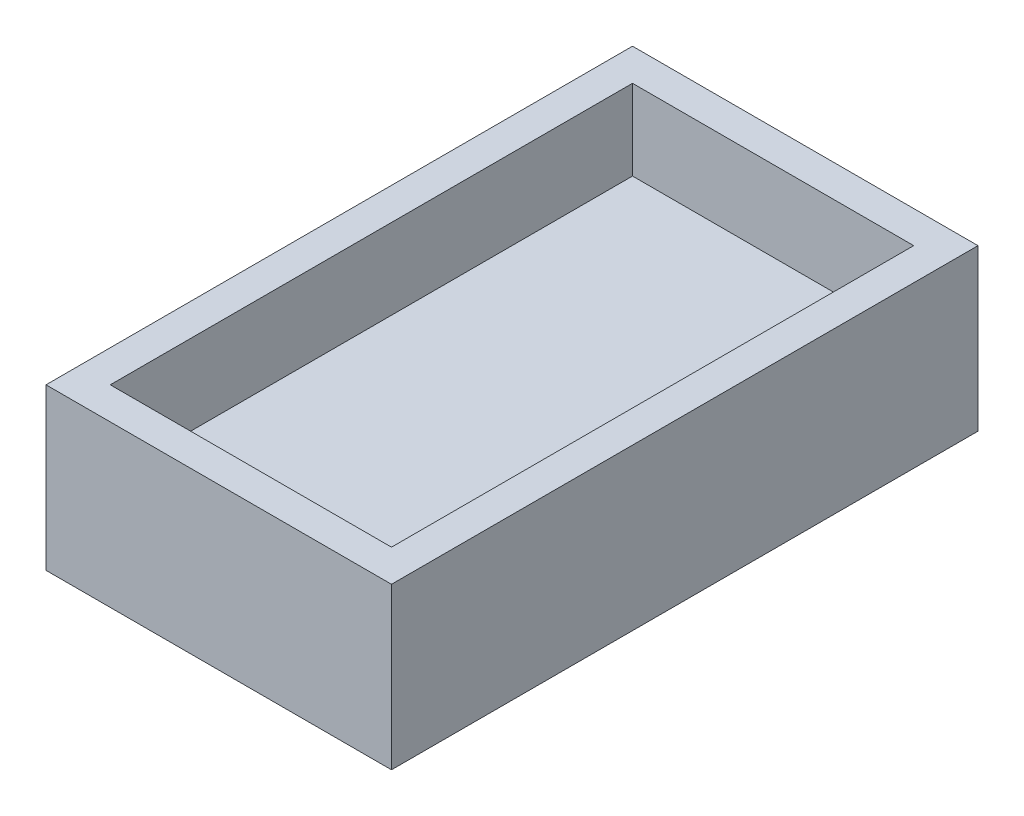
ISO-10303-21;
HEADER;
FILE_DESCRIPTION(('STEP AP214'),'2;1');
FILE_NAME('part.step','',(''),(''),'','','');
FILE_SCHEMA(('AUTOMOTIVE_DESIGN { 1 0 10303 214 1 1 1 1 }'));
ENDSEC;
DATA;
#1=APPLICATION_CONTEXT('core data for automotive mechanical design processes');
#2=APPLICATION_PROTOCOL_DEFINITION('international standard','automotive_design',2000,#1);
#3=PRODUCT_CONTEXT('',#1,'mechanical');
#4=PRODUCT('Part','Part','',(#3));
#5=PRODUCT_RELATED_PRODUCT_CATEGORY('part','',(#4));
#6=PRODUCT_DEFINITION_FORMATION('','',#4);
#7=PRODUCT_DEFINITION_CONTEXT('part definition',#1,'design');
#8=PRODUCT_DEFINITION('design','',#6,#7);
#9=PRODUCT_DEFINITION_SHAPE('','',#8);
#10=(LENGTH_UNIT() NAMED_UNIT(*) SI_UNIT(.MILLI.,.METRE.));
#11=(NAMED_UNIT(*) PLANE_ANGLE_UNIT() SI_UNIT($,.RADIAN.));
#12=(NAMED_UNIT(*) SI_UNIT($,.STERADIAN.) SOLID_ANGLE_UNIT());
#13=UNCERTAINTY_MEASURE_WITH_UNIT(LENGTH_MEASURE(1.E-05),#10,'distance_accuracy_value','');
#14=(GEOMETRIC_REPRESENTATION_CONTEXT(3) GLOBAL_UNCERTAINTY_ASSIGNED_CONTEXT((#13)) GLOBAL_UNIT_ASSIGNED_CONTEXT((#10,
#11,#12)) REPRESENTATION_CONTEXT('',''));
#15=CARTESIAN_POINT('',(0.,0.,0.));
#16=DIRECTION('',(0.,0.,1.));
#17=DIRECTION('',(1.,0.,0.));
#18=AXIS2_PLACEMENT_3D('',#15,#16,#17);
#19=CARTESIAN_POINT('',(44.6193274974726,-6.35,-24.7822308817331));
#20=DIRECTION('',(0.,0.,-1.));
#21=DIRECTION('',(-1.,0.,0.));
#22=AXIS2_PLACEMENT_3D('',#19,#20,#21);
#23=PLANE('',#22);
#24=DIRECTION('',(-1.,0.,0.));
#25=VECTOR('',#24,1.);
#26=CARTESIAN_POINT('',(44.6193274974726,0.,-24.7822308817331));
#27=LINE('',#26,#25);
#28=CARTESIAN_POINT('',(44.6193274974726,0.,-24.7822308817331));
#29=VERTEX_POINT('',#28);
#30=CARTESIAN_POINT('',(17.3143274974727,0.,-24.7822308817331));
#31=VERTEX_POINT('',#30);
#32=EDGE_CURVE('E152',#29,#31,#27,.T.);
#33=ORIENTED_EDGE('',*,*,#32,.F.);
#34=DIRECTION('',(0.,1.,0.));
#35=VECTOR('',#34,1.);
#36=CARTESIAN_POINT('',(44.6193274974726,-6.35,-24.7822308817331));
#37=LINE('',#36,#35);
#38=CARTESIAN_POINT('',(44.6193274974726,-12.7,-24.7822308817331));
#39=VERTEX_POINT('',#38);
#40=EDGE_CURVE('E11',#39,#29,#37,.T.);
#41=ORIENTED_EDGE('',*,*,#40,.F.);
#42=DIRECTION('',(1.,0.,0.));
#43=VECTOR('',#42,1.);
#44=CARTESIAN_POINT('',(17.3143274974727,-12.7,-24.7822308817331));
#45=LINE('',#44,#43);
#46=CARTESIAN_POINT('',(17.3143274974727,-12.7,-24.7822308817331));
#47=VERTEX_POINT('',#46);
#48=EDGE_CURVE('E109',#47,#39,#45,.T.);
#49=ORIENTED_EDGE('',*,*,#48,.F.);
#50=DIRECTION('',(0.,1.,0.));
#51=VECTOR('',#50,1.);
#52=CARTESIAN_POINT('',(17.3143274974727,-6.35,-24.7822308817331));
#53=LINE('',#52,#51);
#54=EDGE_CURVE('E36',#47,#31,#53,.T.);
#55=ORIENTED_EDGE('',*,*,#54,.T.);
#56=EDGE_LOOP('',(#33,#41,#49,#55));
#57=FACE_BOUND('',#56,.T.);
#58=ADVANCED_FACE('F33',(#57),#23,.T.);
#59=CARTESIAN_POINT('',(44.6193274974726,-6.35,-24.7822308817331));
#60=DIRECTION('',(1.,0.,0.));
#61=DIRECTION('',(0.,0.,-1.));
#62=AXIS2_PLACEMENT_3D('',#59,#60,#61);
#63=PLANE('',#62);
#64=DIRECTION('',(0.,0.,-1.));
#65=VECTOR('',#64,1.);
#66=CARTESIAN_POINT('',(44.6193274974726,0.,-24.7822308817331));
#67=LINE('',#66,#65);
#68=CARTESIAN_POINT('',(44.6193274974726,0.,21.5727691182669));
#69=VERTEX_POINT('',#68);
#70=EDGE_CURVE('E107',#69,#29,#67,.T.);
#71=ORIENTED_EDGE('',*,*,#70,.F.);
#72=DIRECTION('',(0.,1.,0.));
#73=VECTOR('',#72,1.);
#74=CARTESIAN_POINT('',(44.6193274974726,-6.35,21.5727691182669));
#75=LINE('',#74,#73);
#76=CARTESIAN_POINT('',(44.6193274974726,-12.7,21.5727691182669));
#77=VERTEX_POINT('',#76);
#78=EDGE_CURVE('E41',#77,#69,#75,.T.);
#79=ORIENTED_EDGE('',*,*,#78,.F.);
#80=DIRECTION('',(0.,0.,1.));
#81=VECTOR('',#80,1.);
#82=CARTESIAN_POINT('',(44.6193274974726,-12.7,-24.7822308817331));
#83=LINE('',#82,#81);
#84=EDGE_CURVE('E112',#39,#77,#83,.T.);
#85=ORIENTED_EDGE('',*,*,#84,.F.);
#86=ORIENTED_EDGE('',*,*,#40,.T.);
#87=EDGE_LOOP('',(#71,#79,#85,#86));
#88=FACE_BOUND('',#87,.T.);
#89=ADVANCED_FACE('F170',(#88),#63,.T.);
#90=CARTESIAN_POINT('',(17.3143274974727,-6.35,21.5727691182669));
#91=DIRECTION('',(0.,0.,1.));
#92=DIRECTION('',(1.,0.,0.));
#93=AXIS2_PLACEMENT_3D('',#90,#91,#92);
#94=PLANE('',#93);
#95=DIRECTION('',(1.,0.,0.));
#96=VECTOR('',#95,1.);
#97=CARTESIAN_POINT('',(17.3143274974727,0.,21.5727691182669));
#98=LINE('',#97,#96);
#99=CARTESIAN_POINT('',(17.3143274974727,0.,21.5727691182669));
#100=VERTEX_POINT('',#99);
#101=EDGE_CURVE('E160',#100,#69,#98,.T.);
#102=ORIENTED_EDGE('',*,*,#101,.F.);
#103=DIRECTION('',(0.,1.,0.));
#104=VECTOR('',#103,1.);
#105=CARTESIAN_POINT('',(17.3143274974727,-6.35,21.5727691182669));
#106=LINE('',#105,#104);
#107=CARTESIAN_POINT('',(17.3143274974727,-12.7,21.5727691182669));
#108=VERTEX_POINT('',#107);
#109=EDGE_CURVE('E106',#108,#100,#106,.T.);
#110=ORIENTED_EDGE('',*,*,#109,.F.);
#111=DIRECTION('',(-1.,0.,0.));
#112=VECTOR('',#111,1.);
#113=CARTESIAN_POINT('',(17.3143274974727,-12.7,21.5727691182669));
#114=LINE('',#113,#112);
#115=EDGE_CURVE('E117',#77,#108,#114,.T.);
#116=ORIENTED_EDGE('',*,*,#115,.F.);
#117=ORIENTED_EDGE('',*,*,#78,.T.);
#118=EDGE_LOOP('',(#102,#110,#116,#117));
#119=FACE_BOUND('',#118,.T.);
#120=ADVANCED_FACE('F167',(#119),#94,.T.);
#121=CARTESIAN_POINT('',(17.3143274974727,-6.35,-24.7822308817331));
#122=DIRECTION('',(-1.,0.,0.));
#123=DIRECTION('',(0.,0.,1.));
#124=AXIS2_PLACEMENT_3D('',#121,#122,#123);
#125=PLANE('',#124);
#126=DIRECTION('',(0.,0.,1.));
#127=VECTOR('',#126,1.);
#128=CARTESIAN_POINT('',(17.3143274974727,0.,-24.7822308817331));
#129=LINE('',#128,#127);
#130=EDGE_CURVE('E103',#31,#100,#129,.T.);
#131=ORIENTED_EDGE('',*,*,#130,.F.);
#132=ORIENTED_EDGE('',*,*,#54,.F.);
#133=DIRECTION('',(0.,0.,-1.));
#134=VECTOR('',#133,1.);
#135=CARTESIAN_POINT('',(17.3143274974727,-12.7,-24.7822308817331));
#136=LINE('',#135,#134);
#137=EDGE_CURVE('E101',#108,#47,#136,.T.);
#138=ORIENTED_EDGE('',*,*,#137,.F.);
#139=ORIENTED_EDGE('',*,*,#109,.T.);
#140=EDGE_LOOP('',(#131,#132,#138,#139));
#141=FACE_BOUND('',#140,.T.);
#142=ADVANCED_FACE('F99',(#141),#125,.T.);
#143=CARTESIAN_POINT('',(0.,0.,0.));
#144=DIRECTION('',(0.,1.,0.));
#145=DIRECTION('',(0.,0.,1.));
#146=AXIS2_PLACEMENT_3D('',#143,#144,#145);
#147=PLANE('',#146);
#148=DIRECTION('',(-1.,0.,0.));
#149=VECTOR('',#148,1.);
#150=CARTESIAN_POINT('',(42.0793274974726,0.,-22.2422308817331));
#151=LINE('',#150,#149);
#152=CARTESIAN_POINT('',(42.0793274974726,0.,-22.2422308817331));
#153=VERTEX_POINT('',#152);
#154=CARTESIAN_POINT('',(19.8543274974727,0.,-22.2422308817331));
#155=VERTEX_POINT('',#154);
#156=EDGE_CURVE('E49',#153,#155,#151,.T.);
#157=ORIENTED_EDGE('',*,*,#156,.F.);
#158=DIRECTION('',(0.,0.,-1.));
#159=VECTOR('',#158,1.);
#160=CARTESIAN_POINT('',(42.0793274974726,0.,-22.2422308817331));
#161=LINE('',#160,#159);
#162=CARTESIAN_POINT('',(42.0793274974726,0.,19.0327691182669));
#163=VERTEX_POINT('',#162);
#164=EDGE_CURVE('E131',#163,#153,#161,.T.);
#165=ORIENTED_EDGE('',*,*,#164,.F.);
#166=DIRECTION('',(1.,0.,0.));
#167=VECTOR('',#166,1.);
#168=CARTESIAN_POINT('',(19.8543274974727,0.,19.0327691182669));
#169=LINE('',#168,#167);
#170=CARTESIAN_POINT('',(19.8543274974727,0.,19.0327691182669));
#171=VERTEX_POINT('',#170);
#172=EDGE_CURVE('E145',#171,#163,#169,.T.);
#173=ORIENTED_EDGE('',*,*,#172,.F.);
#174=DIRECTION('',(0.,0.,1.));
#175=VECTOR('',#174,1.);
#176=CARTESIAN_POINT('',(19.8543274974727,0.,-22.2422308817331));
#177=LINE('',#176,#175);
#178=EDGE_CURVE('E142',#155,#171,#177,.T.);
#179=ORIENTED_EDGE('',*,*,#178,.F.);
#180=EDGE_LOOP('',(#157,#165,#173,#179));
#181=FACE_BOUND('',#180,.T.);
#182=ORIENTED_EDGE('',*,*,#32,.T.);
#183=ORIENTED_EDGE('',*,*,#130,.T.);
#184=ORIENTED_EDGE('',*,*,#101,.T.);
#185=ORIENTED_EDGE('',*,*,#70,.T.);
#186=EDGE_LOOP('',(#182,#183,#184,#185));
#187=FACE_BOUND('',#186,.T.);
#188=ADVANCED_FACE('F169',(#181,#187),#147,.T.);
#189=CARTESIAN_POINT('',(42.0793274974726,-6.35,-22.2422308817331));
#190=DIRECTION('',(0.,0.,-1.));
#191=DIRECTION('',(-1.,0.,0.));
#192=AXIS2_PLACEMENT_3D('',#189,#190,#191);
#193=PLANE('',#192);
#194=ORIENTED_EDGE('',*,*,#156,.T.);
#195=DIRECTION('',(0.,1.,0.));
#196=VECTOR('',#195,1.);
#197=CARTESIAN_POINT('',(19.8543274974727,-6.35,-22.2422308817331));
#198=LINE('',#197,#196);
#199=CARTESIAN_POINT('',(19.8543274974727,-6.35,-22.2422308817331));
#200=VERTEX_POINT('',#199);
#201=EDGE_CURVE('E140',#200,#155,#198,.T.);
#202=ORIENTED_EDGE('',*,*,#201,.F.);
#203=DIRECTION('',(-1.,0.,0.));
#204=VECTOR('',#203,1.);
#205=CARTESIAN_POINT('',(42.0793274974726,-6.35,-22.2422308817331));
#206=LINE('',#205,#204);
#207=CARTESIAN_POINT('',(42.0793274974726,-6.35,-22.2422308817331));
#208=VERTEX_POINT('',#207);
#209=EDGE_CURVE('E127',#208,#200,#206,.T.);
#210=ORIENTED_EDGE('',*,*,#209,.F.);
#211=DIRECTION('',(0.,1.,0.));
#212=VECTOR('',#211,1.);
#213=CARTESIAN_POINT('',(42.0793274974726,-6.35,-22.2422308817331));
#214=LINE('',#213,#212);
#215=EDGE_CURVE('E150',#208,#153,#214,.T.);
#216=ORIENTED_EDGE('',*,*,#215,.T.);
#217=EDGE_LOOP('',(#194,#202,#210,#216));
#218=FACE_BOUND('',#217,.T.);
#219=ADVANCED_FACE('F184',(#218),#193,.F.);
#220=CARTESIAN_POINT('',(42.0793274974726,-6.35,-22.2422308817331));
#221=DIRECTION('',(1.,0.,0.));
#222=DIRECTION('',(0.,0.,-1.));
#223=AXIS2_PLACEMENT_3D('',#220,#221,#222);
#224=PLANE('',#223);
#225=ORIENTED_EDGE('',*,*,#164,.T.);
#226=ORIENTED_EDGE('',*,*,#215,.F.);
#227=DIRECTION('',(0.,0.,-1.));
#228=VECTOR('',#227,1.);
#229=CARTESIAN_POINT('',(42.0793274974726,-6.35,-22.2422308817331));
#230=LINE('',#229,#228);
#231=CARTESIAN_POINT('',(42.0793274974726,-6.35,19.0327691182669));
#232=VERTEX_POINT('',#231);
#233=EDGE_CURVE('E137',#232,#208,#230,.T.);
#234=ORIENTED_EDGE('',*,*,#233,.F.);
#235=DIRECTION('',(0.,1.,0.));
#236=VECTOR('',#235,1.);
#237=CARTESIAN_POINT('',(42.0793274974726,-6.35,19.0327691182669));
#238=LINE('',#237,#236);
#239=EDGE_CURVE('E153',#232,#163,#238,.T.);
#240=ORIENTED_EDGE('',*,*,#239,.T.);
#241=EDGE_LOOP('',(#225,#226,#234,#240));
#242=FACE_BOUND('',#241,.T.);
#243=ADVANCED_FACE('F189',(#242),#224,.F.);
#244=CARTESIAN_POINT('',(19.8543274974727,-6.35,19.0327691182669));
#245=DIRECTION('',(0.,0.,1.));
#246=DIRECTION('',(1.,0.,0.));
#247=AXIS2_PLACEMENT_3D('',#244,#245,#246);
#248=PLANE('',#247);
#249=ORIENTED_EDGE('',*,*,#172,.T.);
#250=ORIENTED_EDGE('',*,*,#239,.F.);
#251=DIRECTION('',(1.,0.,0.));
#252=VECTOR('',#251,1.);
#253=CARTESIAN_POINT('',(19.8543274974727,-6.35,19.0327691182669));
#254=LINE('',#253,#252);
#255=CARTESIAN_POINT('',(19.8543274974727,-6.35,19.0327691182669));
#256=VERTEX_POINT('',#255);
#257=EDGE_CURVE('E134',#256,#232,#254,.T.);
#258=ORIENTED_EDGE('',*,*,#257,.F.);
#259=DIRECTION('',(0.,1.,0.));
#260=VECTOR('',#259,1.);
#261=CARTESIAN_POINT('',(19.8543274974727,-6.35,19.0327691182669));
#262=LINE('',#261,#260);
#263=EDGE_CURVE('E155',#256,#171,#262,.T.);
#264=ORIENTED_EDGE('',*,*,#263,.T.);
#265=EDGE_LOOP('',(#249,#250,#258,#264));
#266=FACE_BOUND('',#265,.T.);
#267=ADVANCED_FACE('F203',(#266),#248,.F.);
#268=CARTESIAN_POINT('',(19.8543274974727,-6.35,-22.2422308817331));
#269=DIRECTION('',(-1.,0.,0.));
#270=DIRECTION('',(0.,0.,1.));
#271=AXIS2_PLACEMENT_3D('',#268,#269,#270);
#272=PLANE('',#271);
#273=ORIENTED_EDGE('',*,*,#178,.T.);
#274=ORIENTED_EDGE('',*,*,#263,.F.);
#275=DIRECTION('',(0.,0.,1.));
#276=VECTOR('',#275,1.);
#277=CARTESIAN_POINT('',(19.8543274974727,-6.35,-22.2422308817331));
#278=LINE('',#277,#276);
#279=EDGE_CURVE('E130',#200,#256,#278,.T.);
#280=ORIENTED_EDGE('',*,*,#279,.F.);
#281=ORIENTED_EDGE('',*,*,#201,.T.);
#282=EDGE_LOOP('',(#273,#274,#280,#281));
#283=FACE_BOUND('',#282,.T.);
#284=ADVANCED_FACE('F194',(#283),#272,.F.);
#285=CARTESIAN_POINT('',(0.,-6.35,0.));
#286=DIRECTION('',(0.,1.,0.));
#287=DIRECTION('',(0.,0.,1.));
#288=AXIS2_PLACEMENT_3D('',#285,#286,#287);
#289=PLANE('',#288);
#290=CARTESIAN_POINT('',(39.3958658651162,-6.35,15.7048927848457));
#291=DIRECTION('',(0.,1.,0.));
#292=DIRECTION('',(0.,0.,1.));
#293=AXIS2_PLACEMENT_3D('',#290,#291,#292);
#294=CIRCLE('',#293,1.397);
#295=CARTESIAN_POINT('',(39.3958658651162,-6.35,17.1018927848457));
#296=VERTEX_POINT('',#295);
#297=EDGE_CURVE('E234',#296,#296,#294,.T.);
#298=ORIENTED_EDGE('',*,*,#297,.F.);
#299=EDGE_LOOP('',(#298));
#300=FACE_BOUND('',#299,.T.);
#301=CARTESIAN_POINT('',(39.3958258407739,-6.35,-19.0931072151313));
#302=DIRECTION('',(0.,1.,0.));
#303=DIRECTION('',(0.,0.,1.));
#304=AXIS2_PLACEMENT_3D('',#301,#302,#303);
#305=CIRCLE('',#304,1.39700000000001);
#306=CARTESIAN_POINT('',(39.3958258407739,-6.35,-17.6961072151312));
#307=VERTEX_POINT('',#306);
#308=EDGE_CURVE('E121',#307,#307,#305,.T.);
#309=ORIENTED_EDGE('',*,*,#308,.F.);
#310=EDGE_LOOP('',(#309));
#311=FACE_BOUND('',#310,.T.);
#312=ORIENTED_EDGE('',*,*,#209,.T.);
#313=ORIENTED_EDGE('',*,*,#279,.T.);
#314=ORIENTED_EDGE('',*,*,#257,.T.);
#315=ORIENTED_EDGE('',*,*,#233,.T.);
#316=EDGE_LOOP('',(#312,#313,#314,#315));
#317=FACE_BOUND('',#316,.T.);
#318=ADVANCED_FACE('F200',(#300,#311,#317),#289,.T.);
#319=CARTESIAN_POINT('',(0.,-12.7,0.));
#320=DIRECTION('',(0.,1.,0.));
#321=DIRECTION('',(0.,0.,1.));
#322=AXIS2_PLACEMENT_3D('',#319,#320,#321);
#323=PLANE('',#322);
#324=CARTESIAN_POINT('',(39.3958658651162,-12.7,15.7048927848457));
#325=DIRECTION('',(0.,1.,0.));
#326=DIRECTION('',(0.,0.,1.));
#327=AXIS2_PLACEMENT_3D('',#324,#325,#326);
#328=CIRCLE('',#327,1.397);
#329=CARTESIAN_POINT('',(39.3958658651162,-12.7,17.1018927848457));
#330=VERTEX_POINT('',#329);
#331=EDGE_CURVE('E231',#330,#330,#328,.T.);
#332=ORIENTED_EDGE('',*,*,#331,.T.);
#333=EDGE_LOOP('',(#332));
#334=FACE_BOUND('',#333,.T.);
#335=CARTESIAN_POINT('',(39.3958258407739,-12.7,-19.0931072151313));
#336=DIRECTION('',(0.,1.,0.));
#337=DIRECTION('',(0.,0.,1.));
#338=AXIS2_PLACEMENT_3D('',#335,#336,#337);
#339=CIRCLE('',#338,1.39700000000001);
#340=CARTESIAN_POINT('',(39.3958258407739,-12.7,-17.6961072151312));
#341=VERTEX_POINT('',#340);
#342=EDGE_CURVE('E118',#341,#341,#339,.T.);
#343=ORIENTED_EDGE('',*,*,#342,.T.);
#344=EDGE_LOOP('',(#343));
#345=FACE_BOUND('',#344,.T.);
#346=ORIENTED_EDGE('',*,*,#137,.T.);
#347=ORIENTED_EDGE('',*,*,#48,.T.);
#348=ORIENTED_EDGE('',*,*,#84,.T.);
#349=ORIENTED_EDGE('',*,*,#115,.T.);
#350=EDGE_LOOP('',(#346,#347,#348,#349));
#351=FACE_BOUND('',#350,.T.);
#352=ADVANCED_FACE('F115',(#334,#345,#351),#323,.F.);
#353=CARTESIAN_POINT('',(39.3958258407739,-12.7,-19.0931072151313));
#354=DIRECTION('',(0.,1.,0.));
#355=DIRECTION('',(0.,0.,1.));
#356=AXIS2_PLACEMENT_3D('',#353,#354,#355);
#357=CYLINDRICAL_SURFACE('',#356,1.39700000000001);
#358=ORIENTED_EDGE('',*,*,#342,.F.);
#359=EDGE_LOOP('',(#358));
#360=FACE_BOUND('',#359,.T.);
#361=ORIENTED_EDGE('',*,*,#308,.T.);
#362=EDGE_LOOP('',(#361));
#363=FACE_BOUND('',#362,.T.);
#364=ADVANCED_FACE('F218',(#360,#363),#357,.F.);
#365=CARTESIAN_POINT('',(39.3958658651162,-12.7,15.7048927848457));
#366=DIRECTION('',(0.,1.,0.));
#367=DIRECTION('',(0.,0.,1.));
#368=AXIS2_PLACEMENT_3D('',#365,#366,#367);
#369=CYLINDRICAL_SURFACE('',#368,1.397);
#370=ORIENTED_EDGE('',*,*,#331,.F.);
#371=EDGE_LOOP('',(#370));
#372=FACE_BOUND('',#371,.T.);
#373=ORIENTED_EDGE('',*,*,#297,.T.);
#374=EDGE_LOOP('',(#373));
#375=FACE_BOUND('',#374,.T.);
#376=ADVANCED_FACE('F222',(#372,#375),#369,.F.);
#377=CLOSED_SHELL('',(#58,#89,#120,#142,#188,#219,#243,#267,#284,#318,#352,#364,#376));
#378=MANIFOLD_SOLID_BREP('B2',#377);
#379=ADVANCED_BREP_SHAPE_REPRESENTATION('',(#18,#378),#14);
#380=SHAPE_DEFINITION_REPRESENTATION(#9,#379);
ENDSEC;
END-ISO-10303-21;
